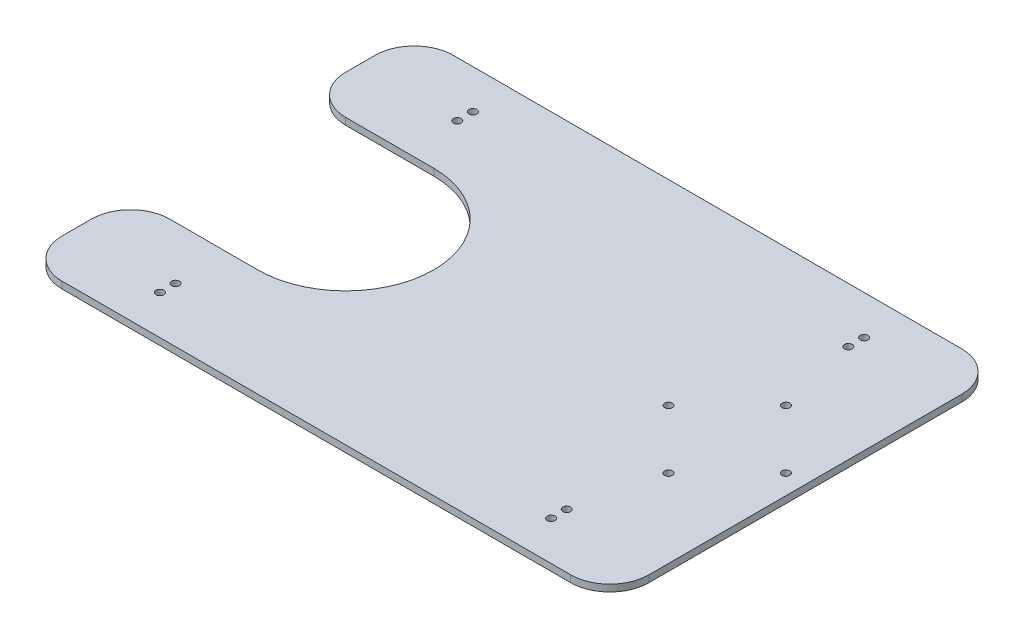
ISO-10303-21;
HEADER;
FILE_DESCRIPTION(('STEP AP214'),'2;1');
FILE_NAME('part.step','',(''),(''),'','','');
FILE_SCHEMA(('AUTOMOTIVE_DESIGN { 1 0 10303 214 1 1 1 1 }'));
ENDSEC;
DATA;
#1=APPLICATION_CONTEXT('core data for automotive mechanical design processes');
#2=APPLICATION_PROTOCOL_DEFINITION('international standard','automotive_design',2000,#1);
#3=PRODUCT_CONTEXT('',#1,'mechanical');
#4=PRODUCT('Part','Part','',(#3));
#5=PRODUCT_RELATED_PRODUCT_CATEGORY('part','',(#4));
#6=PRODUCT_DEFINITION_FORMATION('','',#4);
#7=PRODUCT_DEFINITION_CONTEXT('part definition',#1,'design');
#8=PRODUCT_DEFINITION('design','',#6,#7);
#9=PRODUCT_DEFINITION_SHAPE('','',#8);
#10=(LENGTH_UNIT() NAMED_UNIT(*) SI_UNIT(.MILLI.,.METRE.));
#11=(NAMED_UNIT(*) PLANE_ANGLE_UNIT() SI_UNIT($,.RADIAN.));
#12=(NAMED_UNIT(*) SI_UNIT($,.STERADIAN.) SOLID_ANGLE_UNIT());
#13=UNCERTAINTY_MEASURE_WITH_UNIT(LENGTH_MEASURE(1.E-05),#10,'distance_accuracy_value','');
#14=(GEOMETRIC_REPRESENTATION_CONTEXT(3) GLOBAL_UNCERTAINTY_ASSIGNED_CONTEXT((#13)) GLOBAL_UNIT_ASSIGNED_CONTEXT((#10,
#11,#12)) REPRESENTATION_CONTEXT('',''));
#15=CARTESIAN_POINT('',(0.,0.,0.));
#16=DIRECTION('',(0.,0.,1.));
#17=DIRECTION('',(1.,0.,0.));
#18=AXIS2_PLACEMENT_3D('',#15,#16,#17);
#19=CARTESIAN_POINT('',(-85.,1.75,0.));
#20=DIRECTION('',(0.,-1.,0.));
#21=DIRECTION('',(0.,0.,-1.));
#22=AXIS2_PLACEMENT_3D('',#19,#20,#21);
#23=PLANE('',#22);
#24=DIRECTION('',(0.,0.,1.));
#25=VECTOR('',#24,1.);
#26=CARTESIAN_POINT('',(-150.,1.75,45.));
#27=LINE('',#26,#25);
#28=CARTESIAN_POINT('',(-150.,1.75,65.));
#29=VERTEX_POINT('',#28);
#30=CARTESIAN_POINT('',(-150.,1.75,80.));
#31=VERTEX_POINT('',#30);
#32=EDGE_CURVE('E165',#29,#31,#27,.T.);
#33=ORIENTED_EDGE('',*,*,#32,.T.);
#34=CARTESIAN_POINT('',(-130.,1.75,80.));
#35=DIRECTION('',(0.,-1.,0.));
#36=DIRECTION('',(0.,0.,-1.));
#37=AXIS2_PLACEMENT_3D('',#34,#35,#36);
#38=CIRCLE('',#37,20.);
#39=CARTESIAN_POINT('',(-130.,1.75,100.));
#40=VERTEX_POINT('',#39);
#41=EDGE_CURVE('E226',#31,#40,#38,.F.);
#42=ORIENTED_EDGE('',*,*,#41,.T.);
#43=DIRECTION('',(1.,0.,0.));
#44=VECTOR('',#43,1.);
#45=CARTESIAN_POINT('',(-150.,1.75,100.));
#46=LINE('',#45,#44);
#47=CARTESIAN_POINT('',(130.,1.75,100.));
#48=VERTEX_POINT('',#47);
#49=EDGE_CURVE('E170',#40,#48,#46,.T.);
#50=ORIENTED_EDGE('',*,*,#49,.T.);
#51=CARTESIAN_POINT('',(130.,1.75,80.));
#52=DIRECTION('',(0.,-1.,0.));
#53=DIRECTION('',(0.,0.,-1.));
#54=AXIS2_PLACEMENT_3D('',#51,#52,#53);
#55=CIRCLE('',#54,20.);
#56=CARTESIAN_POINT('',(150.,1.75,80.));
#57=VERTEX_POINT('',#56);
#58=EDGE_CURVE('E217',#48,#57,#55,.F.);
#59=ORIENTED_EDGE('',*,*,#58,.T.);
#60=DIRECTION('',(0.,0.,-1.));
#61=VECTOR('',#60,1.);
#62=CARTESIAN_POINT('',(150.,1.75,-100.));
#63=LINE('',#62,#61);
#64=CARTESIAN_POINT('',(150.,1.75,-80.));
#65=VERTEX_POINT('',#64);
#66=EDGE_CURVE('E194',#57,#65,#63,.T.);
#67=ORIENTED_EDGE('',*,*,#66,.T.);
#68=CARTESIAN_POINT('',(130.,1.75,-80.));
#69=DIRECTION('',(0.,-1.,0.));
#70=DIRECTION('',(0.,0.,-1.));
#71=AXIS2_PLACEMENT_3D('',#68,#69,#70);
#72=CIRCLE('',#71,20.);
#73=CARTESIAN_POINT('',(130.,1.75,-100.));
#74=VERTEX_POINT('',#73);
#75=EDGE_CURVE('E219',#65,#74,#72,.F.);
#76=ORIENTED_EDGE('',*,*,#75,.T.);
#77=DIRECTION('',(-1.,0.,0.));
#78=VECTOR('',#77,1.);
#79=CARTESIAN_POINT('',(-150.,1.75,-100.));
#80=LINE('',#79,#78);
#81=CARTESIAN_POINT('',(-130.,1.75,-100.));
#82=VERTEX_POINT('',#81);
#83=EDGE_CURVE('E264',#74,#82,#80,.T.);
#84=ORIENTED_EDGE('',*,*,#83,.T.);
#85=CARTESIAN_POINT('',(-130.,1.75,-80.));
#86=DIRECTION('',(0.,-1.,0.));
#87=DIRECTION('',(0.,0.,-1.));
#88=AXIS2_PLACEMENT_3D('',#85,#86,#87);
#89=CIRCLE('',#88,20.);
#90=CARTESIAN_POINT('',(-150.,1.75,-80.));
#91=VERTEX_POINT('',#90);
#92=EDGE_CURVE('E221',#82,#91,#89,.F.);
#93=ORIENTED_EDGE('',*,*,#92,.T.);
#94=DIRECTION('',(0.,0.,1.));
#95=VECTOR('',#94,1.);
#96=CARTESIAN_POINT('',(-150.,1.75,-100.));
#97=LINE('',#96,#95);
#98=CARTESIAN_POINT('',(-150.,1.75,-65.));
#99=VERTEX_POINT('',#98);
#100=EDGE_CURVE('E149',#91,#99,#97,.T.);
#101=ORIENTED_EDGE('',*,*,#100,.T.);
#102=CARTESIAN_POINT('',(-130.,1.75,-65.));
#103=DIRECTION('',(0.,-1.,0.));
#104=DIRECTION('',(0.,0.,-1.));
#105=AXIS2_PLACEMENT_3D('',#102,#103,#104);
#106=CIRCLE('',#105,20.);
#107=CARTESIAN_POINT('',(-130.,1.75,-45.));
#108=VERTEX_POINT('',#107);
#109=EDGE_CURVE('E62',#99,#108,#106,.F.);
#110=ORIENTED_EDGE('',*,*,#109,.T.);
#111=DIRECTION('',(1.,0.,0.));
#112=VECTOR('',#111,1.);
#113=CARTESIAN_POINT('',(-150.,1.75,-45.));
#114=LINE('',#113,#112);
#115=CARTESIAN_POINT('',(-85.,1.75,-45.));
#116=VERTEX_POINT('',#115);
#117=EDGE_CURVE('E139',#108,#116,#114,.T.);
#118=ORIENTED_EDGE('',*,*,#117,.T.);
#119=CARTESIAN_POINT('',(-85.,1.75,0.));
#120=DIRECTION('',(0.,-1.,0.));
#121=DIRECTION('',(0.,0.,-1.));
#122=AXIS2_PLACEMENT_3D('',#119,#120,#121);
#123=CIRCLE('',#122,45.);
#124=CARTESIAN_POINT('',(-85.,1.75,45.));
#125=VERTEX_POINT('',#124);
#126=EDGE_CURVE('E144',#116,#125,#123,.T.);
#127=ORIENTED_EDGE('',*,*,#126,.T.);
#128=DIRECTION('',(-1.,0.,0.));
#129=VECTOR('',#128,1.);
#130=CARTESIAN_POINT('',(-85.,1.75,45.));
#131=LINE('',#130,#129);
#132=CARTESIAN_POINT('',(-130.,1.75,45.));
#133=VERTEX_POINT('',#132);
#134=EDGE_CURVE('E163',#125,#133,#131,.T.);
#135=ORIENTED_EDGE('',*,*,#134,.T.);
#136=CARTESIAN_POINT('',(-130.,1.75,65.));
#137=DIRECTION('',(0.,-1.,0.));
#138=DIRECTION('',(0.,0.,-1.));
#139=AXIS2_PLACEMENT_3D('',#136,#137,#138);
#140=CIRCLE('',#139,20.);
#141=EDGE_CURVE('E224',#133,#29,#140,.F.);
#142=ORIENTED_EDGE('',*,*,#141,.T.);
#143=EDGE_LOOP('',(#33,#42,#50,#59,#67,#76,#84,#93,#101,#110,#118,#127,#135,#142));
#144=FACE_BOUND('',#143,.T.);
#145=CARTESIAN_POINT('',(-100.,1.75,-80.));
#146=DIRECTION('',(0.,1.,0.));
#147=DIRECTION('',(0.,0.,1.));
#148=AXIS2_PLACEMENT_3D('',#145,#146,#147);
#149=CIRCLE('',#148,2.);
#150=CARTESIAN_POINT('',(-100.,1.75,-78.));
#151=VERTEX_POINT('',#150);
#152=EDGE_CURVE('E177',#151,#151,#149,.T.);
#153=ORIENTED_EDGE('',*,*,#152,.F.);
#154=EDGE_LOOP('',(#153));
#155=FACE_BOUND('',#154,.T.);
#156=CARTESIAN_POINT('',(100.,1.75,-80.));
#157=DIRECTION('',(0.,1.,0.));
#158=DIRECTION('',(0.,0.,1.));
#159=AXIS2_PLACEMENT_3D('',#156,#157,#158);
#160=CIRCLE('',#159,2.);
#161=CARTESIAN_POINT('',(100.,1.75,-78.));
#162=VERTEX_POINT('',#161);
#163=EDGE_CURVE('E272',#162,#162,#160,.T.);
#164=ORIENTED_EDGE('',*,*,#163,.F.);
#165=EDGE_LOOP('',(#164));
#166=FACE_BOUND('',#165,.T.);
#167=CARTESIAN_POINT('',(100.,1.75,80.));
#168=DIRECTION('',(0.,1.,0.));
#169=DIRECTION('',(0.,0.,1.));
#170=AXIS2_PLACEMENT_3D('',#167,#168,#169);
#171=CIRCLE('',#170,2.);
#172=CARTESIAN_POINT('',(100.,1.75,82.));
#173=VERTEX_POINT('',#172);
#174=EDGE_CURVE('E278',#173,#173,#171,.T.);
#175=ORIENTED_EDGE('',*,*,#174,.F.);
#176=EDGE_LOOP('',(#175));
#177=FACE_BOUND('',#176,.T.);
#178=CARTESIAN_POINT('',(-100.,1.75,80.));
#179=DIRECTION('',(0.,1.,0.));
#180=DIRECTION('',(0.,0.,1.));
#181=AXIS2_PLACEMENT_3D('',#178,#179,#180);
#182=CIRCLE('',#181,2.);
#183=CARTESIAN_POINT('',(-100.,1.75,82.));
#184=VERTEX_POINT('',#183);
#185=EDGE_CURVE('E284',#184,#184,#182,.T.);
#186=ORIENTED_EDGE('',*,*,#185,.F.);
#187=EDGE_LOOP('',(#186));
#188=FACE_BOUND('',#187,.T.);
#189=CARTESIAN_POINT('',(-100.,1.75,-72.));
#190=DIRECTION('',(0.,1.,0.));
#191=DIRECTION('',(0.,0.,1.));
#192=AXIS2_PLACEMENT_3D('',#189,#190,#191);
#193=CIRCLE('',#192,2.);
#194=CARTESIAN_POINT('',(-100.,1.75,-70.));
#195=VERTEX_POINT('',#194);
#196=EDGE_CURVE('E290',#195,#195,#193,.T.);
#197=ORIENTED_EDGE('',*,*,#196,.F.);
#198=EDGE_LOOP('',(#197));
#199=FACE_BOUND('',#198,.T.);
#200=CARTESIAN_POINT('',(100.,1.75,-72.));
#201=DIRECTION('',(0.,1.,0.));
#202=DIRECTION('',(0.,0.,1.));
#203=AXIS2_PLACEMENT_3D('',#200,#201,#202);
#204=CIRCLE('',#203,2.);
#205=CARTESIAN_POINT('',(100.,1.75,-70.));
#206=VERTEX_POINT('',#205);
#207=EDGE_CURVE('E296',#206,#206,#204,.T.);
#208=ORIENTED_EDGE('',*,*,#207,.F.);
#209=EDGE_LOOP('',(#208));
#210=FACE_BOUND('',#209,.T.);
#211=CARTESIAN_POINT('',(100.,1.75,72.));
#212=DIRECTION('',(0.,1.,0.));
#213=DIRECTION('',(0.,0.,1.));
#214=AXIS2_PLACEMENT_3D('',#211,#212,#213);
#215=CIRCLE('',#214,2.);
#216=CARTESIAN_POINT('',(100.,1.75,74.));
#217=VERTEX_POINT('',#216);
#218=EDGE_CURVE('E302',#217,#217,#215,.T.);
#219=ORIENTED_EDGE('',*,*,#218,.F.);
#220=EDGE_LOOP('',(#219));
#221=FACE_BOUND('',#220,.T.);
#222=CARTESIAN_POINT('',(-100.,1.75,72.));
#223=DIRECTION('',(0.,1.,0.));
#224=DIRECTION('',(0.,0.,1.));
#225=AXIS2_PLACEMENT_3D('',#222,#223,#224);
#226=CIRCLE('',#225,2.);
#227=CARTESIAN_POINT('',(-100.,1.75,74.));
#228=VERTEX_POINT('',#227);
#229=EDGE_CURVE('E308',#228,#228,#226,.T.);
#230=ORIENTED_EDGE('',*,*,#229,.F.);
#231=EDGE_LOOP('',(#230));
#232=FACE_BOUND('',#231,.T.);
#233=CARTESIAN_POINT('',(110.,1.75,-30.));
#234=DIRECTION('',(0.,1.,0.));
#235=DIRECTION('',(0.,0.,1.));
#236=AXIS2_PLACEMENT_3D('',#233,#234,#235);
#237=CIRCLE('',#236,2.);
#238=CARTESIAN_POINT('',(110.,1.75,-28.));
#239=VERTEX_POINT('',#238);
#240=EDGE_CURVE('E314',#239,#239,#237,.T.);
#241=ORIENTED_EDGE('',*,*,#240,.F.);
#242=EDGE_LOOP('',(#241));
#243=FACE_BOUND('',#242,.T.);
#244=CARTESIAN_POINT('',(140.000000000001,1.75,-8.32667268468867E-13));
#245=DIRECTION('',(0.,1.,0.));
#246=DIRECTION('',(0.,0.,1.));
#247=AXIS2_PLACEMENT_3D('',#244,#245,#246);
#248=CIRCLE('',#247,2.);
#249=CARTESIAN_POINT('',(140.000000000001,1.75,1.99999999999916));
#250=VERTEX_POINT('',#249);
#251=EDGE_CURVE('E320',#250,#250,#248,.T.);
#252=ORIENTED_EDGE('',*,*,#251,.F.);
#253=EDGE_LOOP('',(#252));
#254=FACE_BOUND('',#253,.T.);
#255=CARTESIAN_POINT('',(110.000000000002,1.75,30.));
#256=DIRECTION('',(0.,1.,0.));
#257=DIRECTION('',(0.,0.,1.));
#258=AXIS2_PLACEMENT_3D('',#255,#256,#257);
#259=CIRCLE('',#258,1.99999999999999);
#260=CARTESIAN_POINT('',(110.000000000002,1.75,32.));
#261=VERTEX_POINT('',#260);
#262=EDGE_CURVE('E326',#261,#261,#259,.T.);
#263=ORIENTED_EDGE('',*,*,#262,.F.);
#264=EDGE_LOOP('',(#263));
#265=FACE_BOUND('',#264,.T.);
#266=CARTESIAN_POINT('',(80.0000000000008,1.75,6.38378239159465E-13));
#267=DIRECTION('',(0.,1.,0.));
#268=DIRECTION('',(0.,0.,1.));
#269=AXIS2_PLACEMENT_3D('',#266,#267,#268);
#270=CIRCLE('',#269,1.99999999999999);
#271=CARTESIAN_POINT('',(80.0000000000008,1.75,2.00000000000063));
#272=VERTEX_POINT('',#271);
#273=EDGE_CURVE('E332',#272,#272,#270,.T.);
#274=ORIENTED_EDGE('',*,*,#273,.F.);
#275=EDGE_LOOP('',(#274));
#276=FACE_BOUND('',#275,.T.);
#277=ADVANCED_FACE('F39',(#144,#155,#166,#177,#188,#199,#210,#221,#232,#243,#254,#265,#276),#23,.F.);
#278=CARTESIAN_POINT('',(-85.,-1.75,0.));
#279=DIRECTION('',(0.,-1.,0.));
#280=DIRECTION('',(0.,0.,-1.));
#281=AXIS2_PLACEMENT_3D('',#278,#279,#280);
#282=PLANE('',#281);
#283=CARTESIAN_POINT('',(110.000000000002,-1.75,30.));
#284=DIRECTION('',(0.,1.,0.));
#285=DIRECTION('',(0.,0.,1.));
#286=AXIS2_PLACEMENT_3D('',#283,#284,#285);
#287=CIRCLE('',#286,1.99999999999999);
#288=CARTESIAN_POINT('',(110.000000000002,-1.75,32.));
#289=VERTEX_POINT('',#288);
#290=EDGE_CURVE('E329',#289,#289,#287,.T.);
#291=ORIENTED_EDGE('',*,*,#290,.T.);
#292=EDGE_LOOP('',(#291));
#293=FACE_BOUND('',#292,.T.);
#294=CARTESIAN_POINT('',(110.,-1.75,-30.));
#295=DIRECTION('',(0.,1.,0.));
#296=DIRECTION('',(0.,0.,1.));
#297=AXIS2_PLACEMENT_3D('',#294,#295,#296);
#298=CIRCLE('',#297,2.);
#299=CARTESIAN_POINT('',(110.,-1.75,-28.));
#300=VERTEX_POINT('',#299);
#301=EDGE_CURVE('E317',#300,#300,#298,.T.);
#302=ORIENTED_EDGE('',*,*,#301,.T.);
#303=EDGE_LOOP('',(#302));
#304=FACE_BOUND('',#303,.T.);
#305=CARTESIAN_POINT('',(100.,-1.75,72.));
#306=DIRECTION('',(0.,1.,0.));
#307=DIRECTION('',(0.,0.,1.));
#308=AXIS2_PLACEMENT_3D('',#305,#306,#307);
#309=CIRCLE('',#308,2.);
#310=CARTESIAN_POINT('',(100.,-1.75,74.));
#311=VERTEX_POINT('',#310);
#312=EDGE_CURVE('E305',#311,#311,#309,.T.);
#313=ORIENTED_EDGE('',*,*,#312,.T.);
#314=EDGE_LOOP('',(#313));
#315=FACE_BOUND('',#314,.T.);
#316=CARTESIAN_POINT('',(-100.,-1.75,-72.));
#317=DIRECTION('',(0.,1.,0.));
#318=DIRECTION('',(0.,0.,1.));
#319=AXIS2_PLACEMENT_3D('',#316,#317,#318);
#320=CIRCLE('',#319,2.);
#321=CARTESIAN_POINT('',(-100.,-1.75,-70.));
#322=VERTEX_POINT('',#321);
#323=EDGE_CURVE('E293',#322,#322,#320,.T.);
#324=ORIENTED_EDGE('',*,*,#323,.T.);
#325=EDGE_LOOP('',(#324));
#326=FACE_BOUND('',#325,.T.);
#327=CARTESIAN_POINT('',(100.,-1.75,80.));
#328=DIRECTION('',(0.,1.,0.));
#329=DIRECTION('',(0.,0.,1.));
#330=AXIS2_PLACEMENT_3D('',#327,#328,#329);
#331=CIRCLE('',#330,2.);
#332=CARTESIAN_POINT('',(100.,-1.75,82.));
#333=VERTEX_POINT('',#332);
#334=EDGE_CURVE('E281',#333,#333,#331,.T.);
#335=ORIENTED_EDGE('',*,*,#334,.T.);
#336=EDGE_LOOP('',(#335));
#337=FACE_BOUND('',#336,.T.);
#338=CARTESIAN_POINT('',(-100.,-1.75,-80.));
#339=DIRECTION('',(0.,1.,0.));
#340=DIRECTION('',(0.,0.,1.));
#341=AXIS2_PLACEMENT_3D('',#338,#339,#340);
#342=CIRCLE('',#341,2.);
#343=CARTESIAN_POINT('',(-100.,-1.75,-78.));
#344=VERTEX_POINT('',#343);
#345=EDGE_CURVE('E269',#344,#344,#342,.T.);
#346=ORIENTED_EDGE('',*,*,#345,.T.);
#347=EDGE_LOOP('',(#346));
#348=FACE_BOUND('',#347,.T.);
#349=DIRECTION('',(1.,0.,0.));
#350=VECTOR('',#349,1.);
#351=CARTESIAN_POINT('',(-150.,-1.75,100.));
#352=LINE('',#351,#350);
#353=CARTESIAN_POINT('',(-130.,-1.75,100.));
#354=VERTEX_POINT('',#353);
#355=CARTESIAN_POINT('',(130.,-1.75,100.));
#356=VERTEX_POINT('',#355);
#357=EDGE_CURVE('E191',#354,#356,#352,.T.);
#358=ORIENTED_EDGE('',*,*,#357,.F.);
#359=CARTESIAN_POINT('',(-130.,-1.75,80.));
#360=DIRECTION('',(0.,-1.,0.));
#361=DIRECTION('',(0.,0.,-1.));
#362=AXIS2_PLACEMENT_3D('',#359,#360,#361);
#363=CIRCLE('',#362,20.);
#364=CARTESIAN_POINT('',(-150.,-1.75,80.));
#365=VERTEX_POINT('',#364);
#366=EDGE_CURVE('E210',#354,#365,#363,.T.);
#367=ORIENTED_EDGE('',*,*,#366,.T.);
#368=DIRECTION('',(0.,0.,1.));
#369=VECTOR('',#368,1.);
#370=CARTESIAN_POINT('',(-150.,-1.75,45.));
#371=LINE('',#370,#369);
#372=CARTESIAN_POINT('',(-150.,-1.75,65.));
#373=VERTEX_POINT('',#372);
#374=EDGE_CURVE('E188',#373,#365,#371,.T.);
#375=ORIENTED_EDGE('',*,*,#374,.F.);
#376=CARTESIAN_POINT('',(-130.,-1.75,65.));
#377=DIRECTION('',(0.,-1.,0.));
#378=DIRECTION('',(0.,0.,-1.));
#379=AXIS2_PLACEMENT_3D('',#376,#377,#378);
#380=CIRCLE('',#379,20.);
#381=CARTESIAN_POINT('',(-130.,-1.75,45.));
#382=VERTEX_POINT('',#381);
#383=EDGE_CURVE('E208',#373,#382,#380,.T.);
#384=ORIENTED_EDGE('',*,*,#383,.T.);
#385=DIRECTION('',(-1.,0.,0.));
#386=VECTOR('',#385,1.);
#387=CARTESIAN_POINT('',(-85.,-1.75,45.));
#388=LINE('',#387,#386);
#389=CARTESIAN_POINT('',(-85.,-1.75,45.));
#390=VERTEX_POINT('',#389);
#391=EDGE_CURVE('E186',#390,#382,#388,.T.);
#392=ORIENTED_EDGE('',*,*,#391,.F.);
#393=CARTESIAN_POINT('',(-85.,-1.75,0.));
#394=DIRECTION('',(0.,-1.,0.));
#395=DIRECTION('',(0.,0.,-1.));
#396=AXIS2_PLACEMENT_3D('',#393,#394,#395);
#397=CIRCLE('',#396,45.);
#398=CARTESIAN_POINT('',(-85.,-1.75,-45.));
#399=VERTEX_POINT('',#398);
#400=EDGE_CURVE('E184',#399,#390,#397,.T.);
#401=ORIENTED_EDGE('',*,*,#400,.F.);
#402=DIRECTION('',(1.,0.,0.));
#403=VECTOR('',#402,1.);
#404=CARTESIAN_POINT('',(-150.,-1.75,-45.));
#405=LINE('',#404,#403);
#406=CARTESIAN_POINT('',(-130.,-1.75,-45.));
#407=VERTEX_POINT('',#406);
#408=EDGE_CURVE('E155',#407,#399,#405,.T.);
#409=ORIENTED_EDGE('',*,*,#408,.F.);
#410=CARTESIAN_POINT('',(-130.,-1.75,-65.));
#411=DIRECTION('',(0.,-1.,0.));
#412=DIRECTION('',(0.,0.,-1.));
#413=AXIS2_PLACEMENT_3D('',#410,#411,#412);
#414=CIRCLE('',#413,20.);
#415=CARTESIAN_POINT('',(-150.,-1.75,-65.));
#416=VERTEX_POINT('',#415);
#417=EDGE_CURVE('E206',#407,#416,#414,.T.);
#418=ORIENTED_EDGE('',*,*,#417,.T.);
#419=DIRECTION('',(0.,0.,1.));
#420=VECTOR('',#419,1.);
#421=CARTESIAN_POINT('',(-150.,-1.75,-100.));
#422=LINE('',#421,#420);
#423=CARTESIAN_POINT('',(-150.,-1.75,-80.));
#424=VERTEX_POINT('',#423);
#425=EDGE_CURVE('E180',#424,#416,#422,.T.);
#426=ORIENTED_EDGE('',*,*,#425,.F.);
#427=CARTESIAN_POINT('',(-130.,-1.75,-80.));
#428=DIRECTION('',(0.,-1.,0.));
#429=DIRECTION('',(0.,0.,-1.));
#430=AXIS2_PLACEMENT_3D('',#427,#428,#429);
#431=CIRCLE('',#430,20.);
#432=CARTESIAN_POINT('',(-130.,-1.75,-100.));
#433=VERTEX_POINT('',#432);
#434=EDGE_CURVE('E204',#424,#433,#431,.T.);
#435=ORIENTED_EDGE('',*,*,#434,.T.);
#436=DIRECTION('',(-1.,0.,0.));
#437=VECTOR('',#436,1.);
#438=CARTESIAN_POINT('',(-150.,-1.75,-100.));
#439=LINE('',#438,#437);
#440=CARTESIAN_POINT('',(130.,-1.75,-100.));
#441=VERTEX_POINT('',#440);
#442=EDGE_CURVE('E176',#441,#433,#439,.T.);
#443=ORIENTED_EDGE('',*,*,#442,.F.);
#444=CARTESIAN_POINT('',(130.,-1.75,-80.));
#445=DIRECTION('',(0.,-1.,0.));
#446=DIRECTION('',(0.,0.,-1.));
#447=AXIS2_PLACEMENT_3D('',#444,#445,#446);
#448=CIRCLE('',#447,20.);
#449=CARTESIAN_POINT('',(150.,-1.75,-80.));
#450=VERTEX_POINT('',#449);
#451=EDGE_CURVE('E202',#441,#450,#448,.T.);
#452=ORIENTED_EDGE('',*,*,#451,.T.);
#453=DIRECTION('',(0.,0.,-1.));
#454=VECTOR('',#453,1.);
#455=CARTESIAN_POINT('',(150.,-1.75,-100.));
#456=LINE('',#455,#454);
#457=CARTESIAN_POINT('',(150.,-1.75,80.));
#458=VERTEX_POINT('',#457);
#459=EDGE_CURVE('E173',#458,#450,#456,.T.);
#460=ORIENTED_EDGE('',*,*,#459,.F.);
#461=CARTESIAN_POINT('',(130.,-1.75,80.));
#462=DIRECTION('',(0.,-1.,0.));
#463=DIRECTION('',(0.,0.,-1.));
#464=AXIS2_PLACEMENT_3D('',#461,#462,#463);
#465=CIRCLE('',#464,20.);
#466=EDGE_CURVE('E200',#458,#356,#465,.T.);
#467=ORIENTED_EDGE('',*,*,#466,.T.);
#468=EDGE_LOOP('',(#358,#367,#375,#384,#392,#401,#409,#418,#426,#435,#443,#452,#460,#467));
#469=FACE_BOUND('',#468,.T.);
#470=CARTESIAN_POINT('',(100.,-1.75,-80.));
#471=DIRECTION('',(0.,1.,0.));
#472=DIRECTION('',(0.,0.,1.));
#473=AXIS2_PLACEMENT_3D('',#470,#471,#472);
#474=CIRCLE('',#473,2.);
#475=CARTESIAN_POINT('',(100.,-1.75,-78.));
#476=VERTEX_POINT('',#475);
#477=EDGE_CURVE('E275',#476,#476,#474,.T.);
#478=ORIENTED_EDGE('',*,*,#477,.T.);
#479=EDGE_LOOP('',(#478));
#480=FACE_BOUND('',#479,.T.);
#481=CARTESIAN_POINT('',(-100.,-1.75,80.));
#482=DIRECTION('',(0.,1.,0.));
#483=DIRECTION('',(0.,0.,1.));
#484=AXIS2_PLACEMENT_3D('',#481,#482,#483);
#485=CIRCLE('',#484,2.);
#486=CARTESIAN_POINT('',(-100.,-1.75,82.));
#487=VERTEX_POINT('',#486);
#488=EDGE_CURVE('E287',#487,#487,#485,.T.);
#489=ORIENTED_EDGE('',*,*,#488,.T.);
#490=EDGE_LOOP('',(#489));
#491=FACE_BOUND('',#490,.T.);
#492=CARTESIAN_POINT('',(100.,-1.75,-72.));
#493=DIRECTION('',(0.,1.,0.));
#494=DIRECTION('',(0.,0.,1.));
#495=AXIS2_PLACEMENT_3D('',#492,#493,#494);
#496=CIRCLE('',#495,2.);
#497=CARTESIAN_POINT('',(100.,-1.75,-70.));
#498=VERTEX_POINT('',#497);
#499=EDGE_CURVE('E299',#498,#498,#496,.T.);
#500=ORIENTED_EDGE('',*,*,#499,.T.);
#501=EDGE_LOOP('',(#500));
#502=FACE_BOUND('',#501,.T.);
#503=CARTESIAN_POINT('',(-100.,-1.75,72.));
#504=DIRECTION('',(0.,1.,0.));
#505=DIRECTION('',(0.,0.,1.));
#506=AXIS2_PLACEMENT_3D('',#503,#504,#505);
#507=CIRCLE('',#506,2.);
#508=CARTESIAN_POINT('',(-100.,-1.75,74.));
#509=VERTEX_POINT('',#508);
#510=EDGE_CURVE('E311',#509,#509,#507,.T.);
#511=ORIENTED_EDGE('',*,*,#510,.T.);
#512=EDGE_LOOP('',(#511));
#513=FACE_BOUND('',#512,.T.);
#514=CARTESIAN_POINT('',(140.000000000001,-1.75,-8.32667268468867E-13));
#515=DIRECTION('',(0.,1.,0.));
#516=DIRECTION('',(0.,0.,1.));
#517=AXIS2_PLACEMENT_3D('',#514,#515,#516);
#518=CIRCLE('',#517,2.);
#519=CARTESIAN_POINT('',(140.000000000001,-1.75,1.99999999999916));
#520=VERTEX_POINT('',#519);
#521=EDGE_CURVE('E323',#520,#520,#518,.T.);
#522=ORIENTED_EDGE('',*,*,#521,.T.);
#523=EDGE_LOOP('',(#522));
#524=FACE_BOUND('',#523,.T.);
#525=CARTESIAN_POINT('',(80.0000000000008,-1.75,6.38378239159465E-13));
#526=DIRECTION('',(0.,1.,0.));
#527=DIRECTION('',(0.,0.,1.));
#528=AXIS2_PLACEMENT_3D('',#525,#526,#527);
#529=CIRCLE('',#528,1.99999999999999);
#530=CARTESIAN_POINT('',(80.0000000000008,-1.75,2.00000000000063));
#531=VERTEX_POINT('',#530);
#532=EDGE_CURVE('E335',#531,#531,#529,.T.);
#533=ORIENTED_EDGE('',*,*,#532,.T.);
#534=EDGE_LOOP('',(#533));
#535=FACE_BOUND('',#534,.T.);
#536=ADVANCED_FACE('F252',(#293,#304,#315,#326,#337,#348,#469,#480,#491,#502,#513,#524,#535),
#282,.T.);
#537=CARTESIAN_POINT('',(150.,1.75,-100.));
#538=DIRECTION('',(-1.,0.,0.));
#539=DIRECTION('',(0.,0.,1.));
#540=AXIS2_PLACEMENT_3D('',#537,#538,#539);
#541=PLANE('',#540);
#542=ORIENTED_EDGE('',*,*,#459,.T.);
#543=DIRECTION('',(0.,-1.,0.));
#544=VECTOR('',#543,1.);
#545=CARTESIAN_POINT('',(150.,1.75,-80.));
#546=LINE('',#545,#544);
#547=EDGE_CURVE('E11',#450,#65,#546,.F.);
#548=ORIENTED_EDGE('',*,*,#547,.T.);
#549=ORIENTED_EDGE('',*,*,#66,.F.);
#550=DIRECTION('',(0.,-1.,0.));
#551=VECTOR('',#550,1.);
#552=CARTESIAN_POINT('',(150.,1.75,80.));
#553=LINE('',#552,#551);
#554=EDGE_CURVE('E47',#57,#458,#553,.T.);
#555=ORIENTED_EDGE('',*,*,#554,.T.);
#556=EDGE_LOOP('',(#542,#548,#549,#555));
#557=FACE_BOUND('',#556,.T.);
#558=ADVANCED_FACE('F245',(#557),#541,.F.);
#559=CARTESIAN_POINT('',(-150.,1.75,-100.));
#560=DIRECTION('',(0.,0.,1.));
#561=DIRECTION('',(1.,0.,0.));
#562=AXIS2_PLACEMENT_3D('',#559,#560,#561);
#563=PLANE('',#562);
#564=ORIENTED_EDGE('',*,*,#442,.T.);
#565=DIRECTION('',(0.,-1.,0.));
#566=VECTOR('',#565,1.);
#567=CARTESIAN_POINT('',(-130.,1.75,-100.));
#568=LINE('',#567,#566);
#569=EDGE_CURVE('E239',#433,#82,#568,.F.);
#570=ORIENTED_EDGE('',*,*,#569,.T.);
#571=ORIENTED_EDGE('',*,*,#83,.F.);
#572=DIRECTION('',(0.,-1.,0.));
#573=VECTOR('',#572,1.);
#574=CARTESIAN_POINT('',(130.,1.75,-100.));
#575=LINE('',#574,#573);
#576=EDGE_CURVE('E236',#74,#441,#575,.T.);
#577=ORIENTED_EDGE('',*,*,#576,.T.);
#578=EDGE_LOOP('',(#564,#570,#571,#577));
#579=FACE_BOUND('',#578,.T.);
#580=ADVANCED_FACE('F261',(#579),#563,.F.);
#581=CARTESIAN_POINT('',(-150.,1.75,-100.));
#582=DIRECTION('',(1.,0.,0.));
#583=DIRECTION('',(0.,0.,-1.));
#584=AXIS2_PLACEMENT_3D('',#581,#582,#583);
#585=PLANE('',#584);
#586=ORIENTED_EDGE('',*,*,#425,.T.);
#587=DIRECTION('',(0.,-1.,0.));
#588=VECTOR('',#587,1.);
#589=CARTESIAN_POINT('',(-150.,1.75,-65.));
#590=LINE('',#589,#588);
#591=EDGE_CURVE('E234',#416,#99,#590,.F.);
#592=ORIENTED_EDGE('',*,*,#591,.T.);
#593=ORIENTED_EDGE('',*,*,#100,.F.);
#594=DIRECTION('',(0.,-1.,0.));
#595=VECTOR('',#594,1.);
#596=CARTESIAN_POINT('',(-150.,1.75,-80.));
#597=LINE('',#596,#595);
#598=EDGE_CURVE('E231',#91,#424,#597,.T.);
#599=ORIENTED_EDGE('',*,*,#598,.T.);
#600=EDGE_LOOP('',(#586,#592,#593,#599));
#601=FACE_BOUND('',#600,.T.);
#602=ADVANCED_FACE('F371',(#601),#585,.F.);
#603=CARTESIAN_POINT('',(-150.,1.75,-45.));
#604=DIRECTION('',(0.,0.,-1.));
#605=DIRECTION('',(-1.,0.,0.));
#606=AXIS2_PLACEMENT_3D('',#603,#604,#605);
#607=PLANE('',#606);
#608=ORIENTED_EDGE('',*,*,#117,.F.);
#609=DIRECTION('',(0.,-1.,0.));
#610=VECTOR('',#609,1.);
#611=CARTESIAN_POINT('',(-130.,1.75,-45.));
#612=LINE('',#611,#610);
#613=EDGE_CURVE('E229',#108,#407,#612,.T.);
#614=ORIENTED_EDGE('',*,*,#613,.T.);
#615=ORIENTED_EDGE('',*,*,#408,.T.);
#616=DIRECTION('',(0.,-1.,0.));
#617=VECTOR('',#616,1.);
#618=CARTESIAN_POINT('',(-85.,1.75,-45.));
#619=LINE('',#618,#617);
#620=EDGE_CURVE('E152',#116,#399,#619,.T.);
#621=ORIENTED_EDGE('',*,*,#620,.F.);
#622=EDGE_LOOP('',(#608,#614,#615,#621));
#623=FACE_BOUND('',#622,.T.);
#624=ADVANCED_FACE('F153',(#623),#607,.F.);
#625=CARTESIAN_POINT('',(-85.,1.75,0.));
#626=DIRECTION('',(0.,-1.,0.));
#627=DIRECTION('',(0.,0.,-1.));
#628=AXIS2_PLACEMENT_3D('',#625,#626,#627);
#629=CYLINDRICAL_SURFACE('',#628,45.);
#630=ORIENTED_EDGE('',*,*,#400,.T.);
#631=DIRECTION('',(0.,-1.,0.));
#632=VECTOR('',#631,1.);
#633=CARTESIAN_POINT('',(-85.,1.75,45.));
#634=LINE('',#633,#632);
#635=EDGE_CURVE('E159',#125,#390,#634,.T.);
#636=ORIENTED_EDGE('',*,*,#635,.F.);
#637=ORIENTED_EDGE('',*,*,#126,.F.);
#638=ORIENTED_EDGE('',*,*,#620,.T.);
#639=EDGE_LOOP('',(#630,#636,#637,#638));
#640=FACE_BOUND('',#639,.T.);
#641=ADVANCED_FACE('F161',(#640),#629,.F.);
#642=CARTESIAN_POINT('',(-85.,1.75,45.));
#643=DIRECTION('',(0.,0.,1.));
#644=DIRECTION('',(1.,0.,0.));
#645=AXIS2_PLACEMENT_3D('',#642,#643,#644);
#646=PLANE('',#645);
#647=ORIENTED_EDGE('',*,*,#391,.T.);
#648=DIRECTION('',(0.,-1.,0.));
#649=VECTOR('',#648,1.);
#650=CARTESIAN_POINT('',(-130.,1.75,45.));
#651=LINE('',#650,#649);
#652=EDGE_CURVE('E54',#382,#133,#651,.F.);
#653=ORIENTED_EDGE('',*,*,#652,.T.);
#654=ORIENTED_EDGE('',*,*,#134,.F.);
#655=ORIENTED_EDGE('',*,*,#635,.T.);
#656=EDGE_LOOP('',(#647,#653,#654,#655));
#657=FACE_BOUND('',#656,.T.);
#658=ADVANCED_FACE('F363',(#657),#646,.F.);
#659=CARTESIAN_POINT('',(-150.,1.75,45.));
#660=DIRECTION('',(1.,0.,0.));
#661=DIRECTION('',(0.,0.,-1.));
#662=AXIS2_PLACEMENT_3D('',#659,#660,#661);
#663=PLANE('',#662);
#664=ORIENTED_EDGE('',*,*,#374,.T.);
#665=DIRECTION('',(0.,-1.,0.));
#666=VECTOR('',#665,1.);
#667=CARTESIAN_POINT('',(-150.,1.75,80.));
#668=LINE('',#667,#666);
#669=EDGE_CURVE('E215',#365,#31,#668,.F.);
#670=ORIENTED_EDGE('',*,*,#669,.T.);
#671=ORIENTED_EDGE('',*,*,#32,.F.);
#672=DIRECTION('',(0.,-1.,0.));
#673=VECTOR('',#672,1.);
#674=CARTESIAN_POINT('',(-150.,1.75,65.));
#675=LINE('',#674,#673);
#676=EDGE_CURVE('E212',#29,#373,#675,.T.);
#677=ORIENTED_EDGE('',*,*,#676,.T.);
#678=EDGE_LOOP('',(#664,#670,#671,#677));
#679=FACE_BOUND('',#678,.T.);
#680=ADVANCED_FACE('F359',(#679),#663,.F.);
#681=CARTESIAN_POINT('',(-150.,1.75,100.));
#682=DIRECTION('',(0.,0.,-1.));
#683=DIRECTION('',(-1.,0.,0.));
#684=AXIS2_PLACEMENT_3D('',#681,#682,#683);
#685=PLANE('',#684);
#686=ORIENTED_EDGE('',*,*,#49,.F.);
#687=DIRECTION('',(0.,-1.,0.));
#688=VECTOR('',#687,1.);
#689=CARTESIAN_POINT('',(-130.,1.75,100.));
#690=LINE('',#689,#688);
#691=EDGE_CURVE('E197',#40,#354,#690,.T.);
#692=ORIENTED_EDGE('',*,*,#691,.T.);
#693=ORIENTED_EDGE('',*,*,#357,.T.);
#694=DIRECTION('',(0.,-1.,0.));
#695=VECTOR('',#694,1.);
#696=CARTESIAN_POINT('',(130.,1.75,100.));
#697=LINE('',#696,#695);
#698=EDGE_CURVE('E158',#356,#48,#697,.F.);
#699=ORIENTED_EDGE('',*,*,#698,.T.);
#700=EDGE_LOOP('',(#686,#692,#693,#699));
#701=FACE_BOUND('',#700,.T.);
#702=ADVANCED_FACE('F356',(#701),#685,.F.);
#703=CARTESIAN_POINT('',(-100.,1.75,-80.));
#704=DIRECTION('',(0.,-1.,0.));
#705=DIRECTION('',(0.,0.,-1.));
#706=AXIS2_PLACEMENT_3D('',#703,#704,#705);
#707=CYLINDRICAL_SURFACE('',#706,2.);
#708=ORIENTED_EDGE('',*,*,#152,.T.);
#709=EDGE_LOOP('',(#708));
#710=FACE_BOUND('',#709,.T.);
#711=ORIENTED_EDGE('',*,*,#345,.F.);
#712=EDGE_LOOP('',(#711));
#713=FACE_BOUND('',#712,.T.);
#714=ADVANCED_FACE('F353',(#710,#713),#707,.F.);
#715=CARTESIAN_POINT('',(100.,1.75,-80.));
#716=DIRECTION('',(0.,-1.,0.));
#717=DIRECTION('',(0.,0.,-1.));
#718=AXIS2_PLACEMENT_3D('',#715,#716,#717);
#719=CYLINDRICAL_SURFACE('',#718,2.);
#720=ORIENTED_EDGE('',*,*,#163,.T.);
#721=EDGE_LOOP('',(#720));
#722=FACE_BOUND('',#721,.T.);
#723=ORIENTED_EDGE('',*,*,#477,.F.);
#724=EDGE_LOOP('',(#723));
#725=FACE_BOUND('',#724,.T.);
#726=ADVANCED_FACE('F540',(#722,#725),#719,.F.);
#727=CARTESIAN_POINT('',(100.,1.75,80.));
#728=DIRECTION('',(0.,-1.,0.));
#729=DIRECTION('',(0.,0.,-1.));
#730=AXIS2_PLACEMENT_3D('',#727,#728,#729);
#731=CYLINDRICAL_SURFACE('',#730,2.);
#732=ORIENTED_EDGE('',*,*,#174,.T.);
#733=EDGE_LOOP('',(#732));
#734=FACE_BOUND('',#733,.T.);
#735=ORIENTED_EDGE('',*,*,#334,.F.);
#736=EDGE_LOOP('',(#735));
#737=FACE_BOUND('',#736,.T.);
#738=ADVANCED_FACE('F530',(#734,#737),#731,.F.);
#739=CARTESIAN_POINT('',(-100.,1.75,80.));
#740=DIRECTION('',(0.,-1.,0.));
#741=DIRECTION('',(0.,0.,-1.));
#742=AXIS2_PLACEMENT_3D('',#739,#740,#741);
#743=CYLINDRICAL_SURFACE('',#742,2.);
#744=ORIENTED_EDGE('',*,*,#185,.T.);
#745=EDGE_LOOP('',(#744));
#746=FACE_BOUND('',#745,.T.);
#747=ORIENTED_EDGE('',*,*,#488,.F.);
#748=EDGE_LOOP('',(#747));
#749=FACE_BOUND('',#748,.T.);
#750=ADVANCED_FACE('F520',(#746,#749),#743,.F.);
#751=CARTESIAN_POINT('',(-100.,1.75,-72.));
#752=DIRECTION('',(0.,-1.,0.));
#753=DIRECTION('',(0.,0.,-1.));
#754=AXIS2_PLACEMENT_3D('',#751,#752,#753);
#755=CYLINDRICAL_SURFACE('',#754,2.);
#756=ORIENTED_EDGE('',*,*,#196,.T.);
#757=EDGE_LOOP('',(#756));
#758=FACE_BOUND('',#757,.T.);
#759=ORIENTED_EDGE('',*,*,#323,.F.);
#760=EDGE_LOOP('',(#759));
#761=FACE_BOUND('',#760,.T.);
#762=ADVANCED_FACE('F510',(#758,#761),#755,.F.);
#763=CARTESIAN_POINT('',(100.,1.75,-72.));
#764=DIRECTION('',(0.,-1.,0.));
#765=DIRECTION('',(0.,0.,-1.));
#766=AXIS2_PLACEMENT_3D('',#763,#764,#765);
#767=CYLINDRICAL_SURFACE('',#766,2.);
#768=ORIENTED_EDGE('',*,*,#207,.T.);
#769=EDGE_LOOP('',(#768));
#770=FACE_BOUND('',#769,.T.);
#771=ORIENTED_EDGE('',*,*,#499,.F.);
#772=EDGE_LOOP('',(#771));
#773=FACE_BOUND('',#772,.T.);
#774=ADVANCED_FACE('F500',(#770,#773),#767,.F.);
#775=CARTESIAN_POINT('',(100.,1.75,72.));
#776=DIRECTION('',(0.,-1.,0.));
#777=DIRECTION('',(0.,0.,-1.));
#778=AXIS2_PLACEMENT_3D('',#775,#776,#777);
#779=CYLINDRICAL_SURFACE('',#778,2.);
#780=ORIENTED_EDGE('',*,*,#218,.T.);
#781=EDGE_LOOP('',(#780));
#782=FACE_BOUND('',#781,.T.);
#783=ORIENTED_EDGE('',*,*,#312,.F.);
#784=EDGE_LOOP('',(#783));
#785=FACE_BOUND('',#784,.T.);
#786=ADVANCED_FACE('F490',(#782,#785),#779,.F.);
#787=CARTESIAN_POINT('',(-100.,1.75,72.));
#788=DIRECTION('',(0.,-1.,0.));
#789=DIRECTION('',(0.,0.,-1.));
#790=AXIS2_PLACEMENT_3D('',#787,#788,#789);
#791=CYLINDRICAL_SURFACE('',#790,2.);
#792=ORIENTED_EDGE('',*,*,#229,.T.);
#793=EDGE_LOOP('',(#792));
#794=FACE_BOUND('',#793,.T.);
#795=ORIENTED_EDGE('',*,*,#510,.F.);
#796=EDGE_LOOP('',(#795));
#797=FACE_BOUND('',#796,.T.);
#798=ADVANCED_FACE('F480',(#794,#797),#791,.F.);
#799=CARTESIAN_POINT('',(110.,1.75,-30.));
#800=DIRECTION('',(0.,-1.,0.));
#801=DIRECTION('',(0.,0.,-1.));
#802=AXIS2_PLACEMENT_3D('',#799,#800,#801);
#803=CYLINDRICAL_SURFACE('',#802,2.);
#804=ORIENTED_EDGE('',*,*,#240,.T.);
#805=EDGE_LOOP('',(#804));
#806=FACE_BOUND('',#805,.T.);
#807=ORIENTED_EDGE('',*,*,#301,.F.);
#808=EDGE_LOOP('',(#807));
#809=FACE_BOUND('',#808,.T.);
#810=ADVANCED_FACE('F470',(#806,#809),#803,.F.);
#811=CARTESIAN_POINT('',(140.000000000001,1.75,-8.32667268468867E-13));
#812=DIRECTION('',(0.,-1.,0.));
#813=DIRECTION('',(0.,0.,-1.));
#814=AXIS2_PLACEMENT_3D('',#811,#812,#813);
#815=CYLINDRICAL_SURFACE('',#814,2.);
#816=ORIENTED_EDGE('',*,*,#251,.T.);
#817=EDGE_LOOP('',(#816));
#818=FACE_BOUND('',#817,.T.);
#819=ORIENTED_EDGE('',*,*,#521,.F.);
#820=EDGE_LOOP('',(#819));
#821=FACE_BOUND('',#820,.T.);
#822=ADVANCED_FACE('F460',(#818,#821),#815,.F.);
#823=CARTESIAN_POINT('',(110.000000000002,1.75,30.));
#824=DIRECTION('',(0.,-1.,0.));
#825=DIRECTION('',(0.,0.,-1.));
#826=AXIS2_PLACEMENT_3D('',#823,#824,#825);
#827=CYLINDRICAL_SURFACE('',#826,1.99999999999999);
#828=ORIENTED_EDGE('',*,*,#262,.T.);
#829=EDGE_LOOP('',(#828));
#830=FACE_BOUND('',#829,.T.);
#831=ORIENTED_EDGE('',*,*,#290,.F.);
#832=EDGE_LOOP('',(#831));
#833=FACE_BOUND('',#832,.T.);
#834=ADVANCED_FACE('F451',(#830,#833),#827,.F.);
#835=CARTESIAN_POINT('',(80.0000000000008,1.75,6.38378239159465E-13));
#836=DIRECTION('',(0.,-1.,0.));
#837=DIRECTION('',(0.,0.,-1.));
#838=AXIS2_PLACEMENT_3D('',#835,#836,#837);
#839=CYLINDRICAL_SURFACE('',#838,1.99999999999999);
#840=ORIENTED_EDGE('',*,*,#273,.T.);
#841=EDGE_LOOP('',(#840));
#842=FACE_BOUND('',#841,.T.);
#843=ORIENTED_EDGE('',*,*,#532,.F.);
#844=EDGE_LOOP('',(#843));
#845=FACE_BOUND('',#844,.T.);
#846=ADVANCED_FACE('F341',(#842,#845),#839,.F.);
#847=CARTESIAN_POINT('',(-130.,1.75,80.));
#848=DIRECTION('',(0.,-1.,0.));
#849=DIRECTION('',(0.,0.,-1.));
#850=AXIS2_PLACEMENT_3D('',#847,#848,#849);
#851=CYLINDRICAL_SURFACE('',#850,20.);
#852=ORIENTED_EDGE('',*,*,#41,.F.);
#853=ORIENTED_EDGE('',*,*,#669,.F.);
#854=ORIENTED_EDGE('',*,*,#366,.F.);
#855=ORIENTED_EDGE('',*,*,#691,.F.);
#856=EDGE_LOOP('',(#852,#853,#854,#855));
#857=FACE_BOUND('',#856,.T.);
#858=ADVANCED_FACE('F379',(#857),#851,.T.);
#859=CARTESIAN_POINT('',(-130.,1.75,65.));
#860=DIRECTION('',(0.,-1.,0.));
#861=DIRECTION('',(0.,0.,-1.));
#862=AXIS2_PLACEMENT_3D('',#859,#860,#861);
#863=CYLINDRICAL_SURFACE('',#862,20.);
#864=ORIENTED_EDGE('',*,*,#141,.F.);
#865=ORIENTED_EDGE('',*,*,#652,.F.);
#866=ORIENTED_EDGE('',*,*,#383,.F.);
#867=ORIENTED_EDGE('',*,*,#676,.F.);
#868=EDGE_LOOP('',(#864,#865,#866,#867));
#869=FACE_BOUND('',#868,.T.);
#870=ADVANCED_FACE('F382',(#869),#863,.T.);
#871=CARTESIAN_POINT('',(-130.,1.75,-65.));
#872=DIRECTION('',(0.,-1.,0.));
#873=DIRECTION('',(0.,0.,-1.));
#874=AXIS2_PLACEMENT_3D('',#871,#872,#873);
#875=CYLINDRICAL_SURFACE('',#874,20.);
#876=ORIENTED_EDGE('',*,*,#109,.F.);
#877=ORIENTED_EDGE('',*,*,#591,.F.);
#878=ORIENTED_EDGE('',*,*,#417,.F.);
#879=ORIENTED_EDGE('',*,*,#613,.F.);
#880=EDGE_LOOP('',(#876,#877,#878,#879));
#881=FACE_BOUND('',#880,.T.);
#882=ADVANCED_FACE('F386',(#881),#875,.T.);
#883=CARTESIAN_POINT('',(-130.,1.75,-80.));
#884=DIRECTION('',(0.,-1.,0.));
#885=DIRECTION('',(0.,0.,-1.));
#886=AXIS2_PLACEMENT_3D('',#883,#884,#885);
#887=CYLINDRICAL_SURFACE('',#886,20.);
#888=ORIENTED_EDGE('',*,*,#92,.F.);
#889=ORIENTED_EDGE('',*,*,#569,.F.);
#890=ORIENTED_EDGE('',*,*,#434,.F.);
#891=ORIENTED_EDGE('',*,*,#598,.F.);
#892=EDGE_LOOP('',(#888,#889,#890,#891));
#893=FACE_BOUND('',#892,.T.);
#894=ADVANCED_FACE('F390',(#893),#887,.T.);
#895=CARTESIAN_POINT('',(130.,1.75,-80.));
#896=DIRECTION('',(0.,-1.,0.));
#897=DIRECTION('',(0.,0.,-1.));
#898=AXIS2_PLACEMENT_3D('',#895,#896,#897);
#899=CYLINDRICAL_SURFACE('',#898,20.);
#900=ORIENTED_EDGE('',*,*,#75,.F.);
#901=ORIENTED_EDGE('',*,*,#547,.F.);
#902=ORIENTED_EDGE('',*,*,#451,.F.);
#903=ORIENTED_EDGE('',*,*,#576,.F.);
#904=EDGE_LOOP('',(#900,#901,#902,#903));
#905=FACE_BOUND('',#904,.T.);
#906=ADVANCED_FACE('F258',(#905),#899,.T.);
#907=CARTESIAN_POINT('',(130.,1.75,80.));
#908=DIRECTION('',(0.,-1.,0.));
#909=DIRECTION('',(0.,0.,-1.));
#910=AXIS2_PLACEMENT_3D('',#907,#908,#909);
#911=CYLINDRICAL_SURFACE('',#910,20.);
#912=ORIENTED_EDGE('',*,*,#58,.F.);
#913=ORIENTED_EDGE('',*,*,#698,.F.);
#914=ORIENTED_EDGE('',*,*,#466,.F.);
#915=ORIENTED_EDGE('',*,*,#554,.F.);
#916=EDGE_LOOP('',(#912,#913,#914,#915));
#917=FACE_BOUND('',#916,.T.);
#918=ADVANCED_FACE('F41',(#917),#911,.T.);
#919=CLOSED_SHELL('',(#277,#536,#558,#580,#602,#624,#641,#658,#680,#702,#714,#726,#738,#750,
#762,#774,#786,#798,#810,#822,#834,#846,#858,#870,#882,#894,#906,#918));
#920=MANIFOLD_SOLID_BREP('B2',#919);
#921=ADVANCED_BREP_SHAPE_REPRESENTATION('',(#18,#920),#14);
#922=SHAPE_DEFINITION_REPRESENTATION(#9,#921);
ENDSEC;
END-ISO-10303-21;
